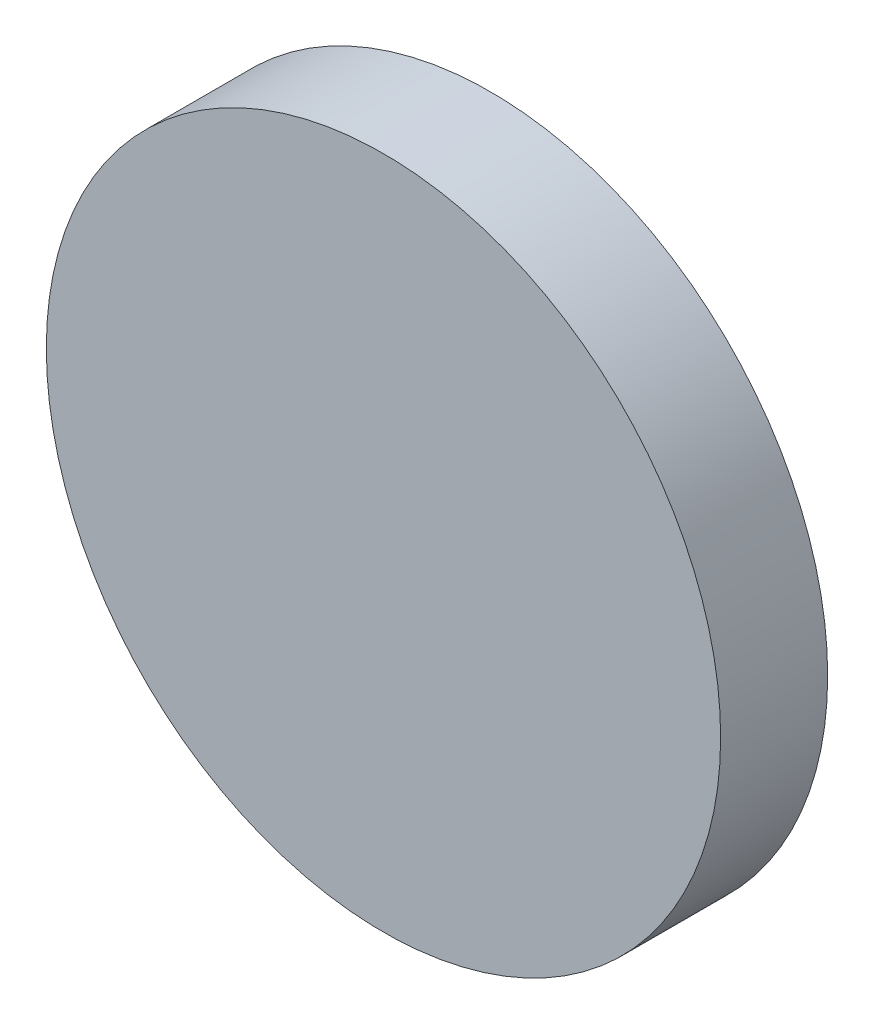
ISO-10303-21;
HEADER;
FILE_DESCRIPTION(('STEP AP214'),'2;1');
FILE_NAME('part.step','',(''),(''),'','','');
FILE_SCHEMA(('AUTOMOTIVE_DESIGN { 1 0 10303 214 1 1 1 1 }'));
ENDSEC;
DATA;
#1=APPLICATION_CONTEXT('core data for automotive mechanical design processes');
#2=APPLICATION_PROTOCOL_DEFINITION('international standard','automotive_design',2000,#1);
#3=PRODUCT_CONTEXT('',#1,'mechanical');
#4=PRODUCT('Part','Part','',(#3));
#5=PRODUCT_RELATED_PRODUCT_CATEGORY('part','',(#4));
#6=PRODUCT_DEFINITION_FORMATION('','',#4);
#7=PRODUCT_DEFINITION_CONTEXT('part definition',#1,'design');
#8=PRODUCT_DEFINITION('design','',#6,#7);
#9=PRODUCT_DEFINITION_SHAPE('','',#8);
#10=(LENGTH_UNIT() NAMED_UNIT(*) SI_UNIT(.MILLI.,.METRE.));
#11=(NAMED_UNIT(*) PLANE_ANGLE_UNIT() SI_UNIT($,.RADIAN.));
#12=(NAMED_UNIT(*) SI_UNIT($,.STERADIAN.) SOLID_ANGLE_UNIT());
#13=UNCERTAINTY_MEASURE_WITH_UNIT(LENGTH_MEASURE(1.E-05),#10,'distance_accuracy_value','');
#14=(GEOMETRIC_REPRESENTATION_CONTEXT(3) GLOBAL_UNCERTAINTY_ASSIGNED_CONTEXT((#13)) GLOBAL_UNIT_ASSIGNED_CONTEXT((#10,
#11,#12)) REPRESENTATION_CONTEXT('',''));
#15=CARTESIAN_POINT('',(0.,0.,0.));
#16=DIRECTION('',(0.,0.,1.));
#17=DIRECTION('',(1.,0.,0.));
#18=AXIS2_PLACEMENT_3D('',#15,#16,#17);
#19=CARTESIAN_POINT('',(92.9999999999994,-34.0999999999995,-2.));
#20=DIRECTION('',(0.,0.,1.));
#21=DIRECTION('',(1.,0.,0.));
#22=AXIS2_PLACEMENT_3D('',#19,#20,#21);
#23=CYLINDRICAL_SURFACE('',#22,6.3);
#24=CARTESIAN_POINT('',(92.9999999999994,-34.0999999999995,-2.));
#25=DIRECTION('',(0.,0.,1.));
#26=DIRECTION('',(1.,0.,0.));
#27=AXIS2_PLACEMENT_3D('',#24,#25,#26);
#28=CIRCLE('',#27,6.3);
#29=CARTESIAN_POINT('',(99.2999999999994,-34.0999999999995,-2.));
#30=VERTEX_POINT('',#29);
#31=EDGE_CURVE('E10',#30,#30,#28,.T.);
#32=ORIENTED_EDGE('',*,*,#31,.T.);
#33=EDGE_LOOP('',(#32));
#34=FACE_BOUND('',#33,.T.);
#35=CARTESIAN_POINT('',(92.9999999999994,-34.0999999999995,0.));
#36=DIRECTION('',(0.,0.,1.));
#37=DIRECTION('',(1.,0.,0.));
#38=AXIS2_PLACEMENT_3D('',#35,#36,#37);
#39=CIRCLE('',#38,6.3);
#40=CARTESIAN_POINT('',(99.2999999999994,-34.0999999999995,0.));
#41=VERTEX_POINT('',#40);
#42=EDGE_CURVE('E35',#41,#41,#39,.T.);
#43=ORIENTED_EDGE('',*,*,#42,.F.);
#44=EDGE_LOOP('',(#43));
#45=FACE_BOUND('',#44,.T.);
#46=ADVANCED_FACE('F32',(#34,#45),#23,.T.);
#47=CARTESIAN_POINT('',(92.9999999999994,-34.0999999999995,-2.));
#48=DIRECTION('',(0.,0.,1.));
#49=DIRECTION('',(1.,0.,0.));
#50=AXIS2_PLACEMENT_3D('',#47,#48,#49);
#51=PLANE('',#50);
#52=ORIENTED_EDGE('',*,*,#31,.F.);
#53=EDGE_LOOP('',(#52));
#54=FACE_BOUND('',#53,.T.);
#55=ADVANCED_FACE('F47',(#54),#51,.F.);
#56=CARTESIAN_POINT('',(92.9999999999994,-34.0999999999995,0.));
#57=DIRECTION('',(0.,0.,1.));
#58=DIRECTION('',(1.,0.,0.));
#59=AXIS2_PLACEMENT_3D('',#56,#57,#58);
#60=PLANE('',#59);
#61=ORIENTED_EDGE('',*,*,#42,.T.);
#62=EDGE_LOOP('',(#61));
#63=FACE_BOUND('',#62,.T.);
#64=ADVANCED_FACE('F44',(#63),#60,.T.);
#65=CLOSED_SHELL('',(#46,#55,#64));
#66=MANIFOLD_SOLID_BREP('B2',#65);
#67=ADVANCED_BREP_SHAPE_REPRESENTATION('',(#18,#66),#14);
#68=SHAPE_DEFINITION_REPRESENTATION(#9,#67);
ENDSEC;
END-ISO-10303-21;
